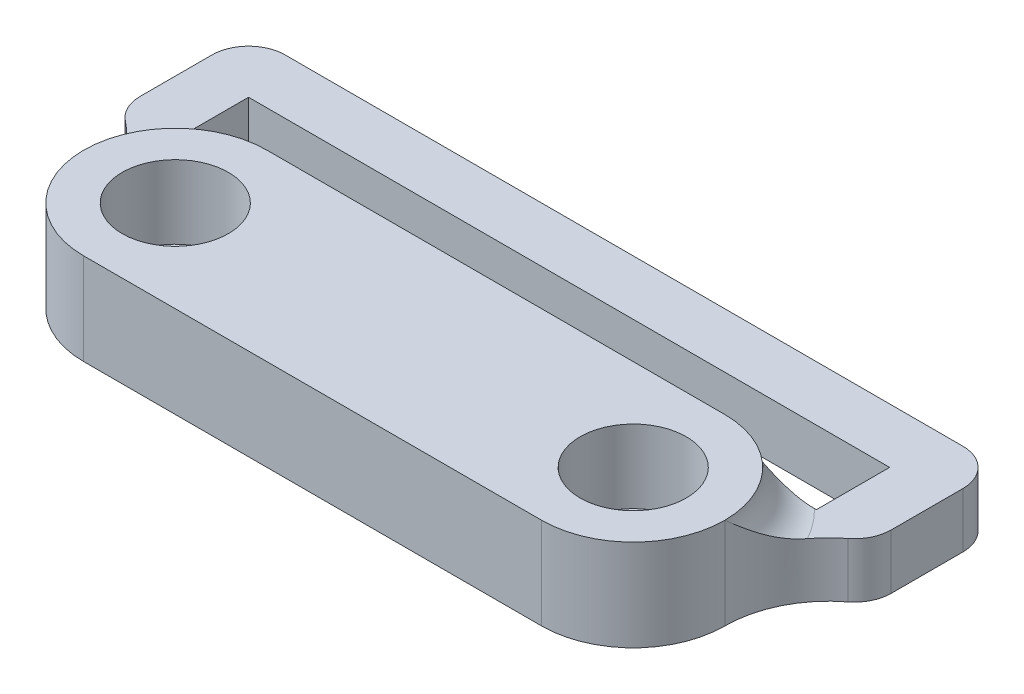
ISO-10303-21;
HEADER;
FILE_DESCRIPTION(('STEP AP214'),'2;1');
FILE_NAME('part.step','',(''),(''),'','','');
FILE_SCHEMA(('AUTOMOTIVE_DESIGN { 1 0 10303 214 1 1 1 1 }'));
ENDSEC;
DATA;
#1=APPLICATION_CONTEXT('core data for automotive mechanical design processes');
#2=APPLICATION_PROTOCOL_DEFINITION('international standard','automotive_design',2000,#1);
#3=PRODUCT_CONTEXT('',#1,'mechanical');
#4=PRODUCT('Part','Part','',(#3));
#5=PRODUCT_RELATED_PRODUCT_CATEGORY('part','',(#4));
#6=PRODUCT_DEFINITION_FORMATION('','',#4);
#7=PRODUCT_DEFINITION_CONTEXT('part definition',#1,'design');
#8=PRODUCT_DEFINITION('design','',#6,#7);
#9=PRODUCT_DEFINITION_SHAPE('','',#8);
#10=(LENGTH_UNIT() NAMED_UNIT(*) SI_UNIT(.MILLI.,.METRE.));
#11=(NAMED_UNIT(*) PLANE_ANGLE_UNIT() SI_UNIT($,.RADIAN.));
#12=(NAMED_UNIT(*) SI_UNIT($,.STERADIAN.) SOLID_ANGLE_UNIT());
#13=UNCERTAINTY_MEASURE_WITH_UNIT(LENGTH_MEASURE(1.E-05),#10,'distance_accuracy_value','');
#14=(GEOMETRIC_REPRESENTATION_CONTEXT(3) GLOBAL_UNCERTAINTY_ASSIGNED_CONTEXT((#13)) GLOBAL_UNIT_ASSIGNED_CONTEXT((#10,
#11,#12)) REPRESENTATION_CONTEXT('',''));
#15=CARTESIAN_POINT('',(0.,0.,0.));
#16=DIRECTION('',(0.,0.,1.));
#17=DIRECTION('',(1.,0.,0.));
#18=AXIS2_PLACEMENT_3D('',#15,#16,#17);
#19=CARTESIAN_POINT('',(12.5,5.,0.));
#20=DIRECTION('',(0.,-1.,0.));
#21=DIRECTION('',(0.,0.,-1.));
#22=AXIS2_PLACEMENT_3D('',#19,#20,#21);
#23=CYLINDRICAL_SURFACE('',#22,5.);
#24=DIRECTION('',(0.,-1.,0.));
#25=VECTOR('',#24,1.);
#26=CARTESIAN_POINT('',(17.5,3.,0.));
#27=LINE('',#26,#25);
#28=CARTESIAN_POINT('',(17.5,5.,0.));
#29=VERTEX_POINT('',#28);
#30=CARTESIAN_POINT('',(17.5,0.,0.));
#31=VERTEX_POINT('',#30);
#32=EDGE_CURVE('E66',#29,#31,#27,.T.);
#33=ORIENTED_EDGE('',*,*,#32,.F.);
#34=CARTESIAN_POINT('',(12.5,5.,0.));
#35=DIRECTION('',(0.,1.,0.));
#36=DIRECTION('',(0.,0.,1.));
#37=AXIS2_PLACEMENT_3D('',#34,#35,#36);
#38=CIRCLE('',#37,5.);
#39=CARTESIAN_POINT('',(12.5,5.,5.));
#40=VERTEX_POINT('',#39);
#41=EDGE_CURVE('E281',#40,#29,#38,.T.);
#42=ORIENTED_EDGE('',*,*,#41,.F.);
#43=DIRECTION('',(0.,-1.,0.));
#44=VECTOR('',#43,1.);
#45=CARTESIAN_POINT('',(12.5,5.,5.));
#46=LINE('',#45,#44);
#47=CARTESIAN_POINT('',(12.5,0.,5.));
#48=VERTEX_POINT('',#47);
#49=EDGE_CURVE('E287',#40,#48,#46,.T.);
#50=ORIENTED_EDGE('',*,*,#49,.T.);
#51=CARTESIAN_POINT('',(12.5,0.,0.));
#52=DIRECTION('',(0.,1.,0.));
#53=DIRECTION('',(0.,0.,1.));
#54=AXIS2_PLACEMENT_3D('',#51,#52,#53);
#55=CIRCLE('',#54,5.);
#56=EDGE_CURVE('E291',#48,#31,#55,.T.);
#57=ORIENTED_EDGE('',*,*,#56,.T.);
#58=EDGE_LOOP('',(#33,#42,#50,#57));
#59=FACE_BOUND('',#58,.T.);
#60=ADVANCED_FACE('F45',(#59),#23,.T.);
#61=CARTESIAN_POINT('',(12.5,5.,0.));
#62=DIRECTION('',(0.,-1.,0.));
#63=DIRECTION('',(0.,0.,-1.));
#64=AXIS2_PLACEMENT_3D('',#61,#62,#63);
#65=CYLINDRICAL_SURFACE('',#64,1.6);
#66=CARTESIAN_POINT('',(12.5,0.,0.));
#67=DIRECTION('',(0.,1.,0.));
#68=DIRECTION('',(0.,0.,1.));
#69=AXIS2_PLACEMENT_3D('',#66,#67,#68);
#70=CIRCLE('',#69,1.6);
#71=CARTESIAN_POINT('',(12.5,0.,1.6));
#72=VERTEX_POINT('',#71);
#73=EDGE_CURVE('E269',#72,#72,#70,.T.);
#74=ORIENTED_EDGE('',*,*,#73,.F.);
#75=EDGE_LOOP('',(#74));
#76=FACE_BOUND('',#75,.T.);
#77=CARTESIAN_POINT('',(12.5,1.,0.));
#78=DIRECTION('',(0.,1.,0.));
#79=DIRECTION('',(0.,0.,1.));
#80=AXIS2_PLACEMENT_3D('',#77,#78,#79);
#81=CIRCLE('',#80,1.6);
#82=CARTESIAN_POINT('',(12.5,1.,1.6));
#83=VERTEX_POINT('',#82);
#84=EDGE_CURVE('E270',#83,#83,#81,.T.);
#85=ORIENTED_EDGE('',*,*,#84,.T.);
#86=EDGE_LOOP('',(#85));
#87=FACE_BOUND('',#86,.T.);
#88=ADVANCED_FACE('F416',(#76,#87),#65,.F.);
#89=CARTESIAN_POINT('',(-12.5,5.,0.));
#90=DIRECTION('',(0.,-1.,0.));
#91=DIRECTION('',(0.,0.,-1.));
#92=AXIS2_PLACEMENT_3D('',#89,#90,#91);
#93=CYLINDRICAL_SURFACE('',#92,1.6);
#94=CARTESIAN_POINT('',(-12.5,0.,0.));
#95=DIRECTION('',(0.,1.,0.));
#96=DIRECTION('',(0.,0.,1.));
#97=AXIS2_PLACEMENT_3D('',#94,#95,#96);
#98=CIRCLE('',#97,1.6);
#99=CARTESIAN_POINT('',(-12.5,0.,1.6));
#100=VERTEX_POINT('',#99);
#101=EDGE_CURVE('E266',#100,#100,#98,.T.);
#102=ORIENTED_EDGE('',*,*,#101,.F.);
#103=EDGE_LOOP('',(#102));
#104=FACE_BOUND('',#103,.T.);
#105=CARTESIAN_POINT('',(-12.5,1.,0.));
#106=DIRECTION('',(0.,1.,0.));
#107=DIRECTION('',(0.,0.,1.));
#108=AXIS2_PLACEMENT_3D('',#105,#106,#107);
#109=CIRCLE('',#108,1.6);
#110=CARTESIAN_POINT('',(-12.5,1.,1.6));
#111=VERTEX_POINT('',#110);
#112=EDGE_CURVE('E257',#111,#111,#109,.T.);
#113=ORIENTED_EDGE('',*,*,#112,.T.);
#114=EDGE_LOOP('',(#113));
#115=FACE_BOUND('',#114,.T.);
#116=ADVANCED_FACE('F412',(#104,#115),#93,.F.);
#117=CARTESIAN_POINT('',(-12.5,5.,0.));
#118=DIRECTION('',(0.,1.,0.));
#119=DIRECTION('',(0.,0.,1.));
#120=AXIS2_PLACEMENT_3D('',#117,#118,#119);
#121=PLANE('',#120);
#122=CARTESIAN_POINT('',(-12.5,5.,0.));
#123=DIRECTION('',(0.,1.,0.));
#124=DIRECTION('',(0.,0.,1.));
#125=AXIS2_PLACEMENT_3D('',#122,#123,#124);
#126=CIRCLE('',#125,2.9);
#127=CARTESIAN_POINT('',(-12.5,5.,2.9));
#128=VERTEX_POINT('',#127);
#129=EDGE_CURVE('E258',#128,#128,#126,.T.);
#130=ORIENTED_EDGE('',*,*,#129,.F.);
#131=EDGE_LOOP('',(#130));
#132=FACE_BOUND('',#131,.T.);
#133=CARTESIAN_POINT('',(12.5,5.,0.));
#134=DIRECTION('',(0.,1.,0.));
#135=DIRECTION('',(0.,0.,1.));
#136=AXIS2_PLACEMENT_3D('',#133,#134,#135);
#137=CIRCLE('',#136,2.9);
#138=CARTESIAN_POINT('',(12.5,5.,2.9));
#139=VERTEX_POINT('',#138);
#140=EDGE_CURVE('E261',#139,#139,#137,.T.);
#141=ORIENTED_EDGE('',*,*,#140,.F.);
#142=EDGE_LOOP('',(#141));
#143=FACE_BOUND('',#142,.T.);
#144=CARTESIAN_POINT('',(-12.5,5.,0.));
#145=DIRECTION('',(0.,1.,0.));
#146=DIRECTION('',(0.,0.,1.));
#147=AXIS2_PLACEMENT_3D('',#144,#145,#146);
#148=CIRCLE('',#147,5.);
#149=CARTESIAN_POINT('',(-12.5,5.,-5.));
#150=VERTEX_POINT('',#149);
#151=CARTESIAN_POINT('',(-17.5,5.,0.));
#152=VERTEX_POINT('',#151);
#153=EDGE_CURVE('E274',#150,#152,#148,.T.);
#154=ORIENTED_EDGE('',*,*,#153,.T.);
#155=CARTESIAN_POINT('',(-12.5,5.,5.));
#156=VERTEX_POINT('',#155);
#157=EDGE_CURVE('E278',#152,#156,#148,.T.);
#158=ORIENTED_EDGE('',*,*,#157,.T.);
#159=DIRECTION('',(1.,0.,0.));
#160=VECTOR('',#159,1.);
#161=CARTESIAN_POINT('',(-12.5,5.,5.));
#162=LINE('',#161,#160);
#163=EDGE_CURVE('E277',#156,#40,#162,.T.);
#164=ORIENTED_EDGE('',*,*,#163,.T.);
#165=ORIENTED_EDGE('',*,*,#41,.T.);
#166=CARTESIAN_POINT('',(12.5,5.,-5.00000000000001));
#167=VERTEX_POINT('',#166);
#168=EDGE_CURVE('E280',#29,#167,#38,.T.);
#169=ORIENTED_EDGE('',*,*,#168,.T.);
#170=DIRECTION('',(-1.,0.,0.));
#171=VECTOR('',#170,1.);
#172=CARTESIAN_POINT('',(-12.5,5.,-5.));
#173=LINE('',#172,#171);
#174=EDGE_CURVE('E284',#167,#150,#173,.T.);
#175=ORIENTED_EDGE('',*,*,#174,.T.);
#176=EDGE_LOOP('',(#154,#158,#164,#165,#169,#175));
#177=FACE_BOUND('',#176,.T.);
#178=ADVANCED_FACE('F415',(#132,#143,#177),#121,.T.);
#179=CARTESIAN_POINT('',(-12.5,0.,0.));
#180=DIRECTION('',(0.,1.,0.));
#181=DIRECTION('',(0.,0.,1.));
#182=AXIS2_PLACEMENT_3D('',#179,#180,#181);
#183=PLANE('',#182);
#184=CARTESIAN_POINT('',(-23.1666666666667,0.,0.));
#185=DIRECTION('',(0.,-1.,0.));
#186=DIRECTION('',(0.,0.,-1.));
#187=AXIS2_PLACEMENT_3D('',#184,#185,#186);
#188=CIRCLE('',#187,5.66666666666669);
#189=CARTESIAN_POINT('',(-19.7173913043478,0.,-4.4959549136987));
#190=VERTEX_POINT('',#189);
#191=CARTESIAN_POINT('',(-17.5,0.,0.));
#192=VERTEX_POINT('',#191);
#193=EDGE_CURVE('E238',#190,#192,#188,.T.);
#194=ORIENTED_EDGE('',*,*,#193,.F.);
#195=CARTESIAN_POINT('',(-18.5,0.,-6.08276253029823));
#196=DIRECTION('',(0.,1.,0.));
#197=DIRECTION('',(0.,0.,1.));
#198=AXIS2_PLACEMENT_3D('',#195,#196,#197);
#199=CIRCLE('',#198,2.);
#200=CARTESIAN_POINT('',(-20.5,0.,-6.08276253029823));
#201=VERTEX_POINT('',#200);
#202=EDGE_CURVE('E313',#190,#201,#199,.F.);
#203=ORIENTED_EDGE('',*,*,#202,.T.);
#204=DIRECTION('',(0.,0.,-1.));
#205=VECTOR('',#204,1.);
#206=CARTESIAN_POINT('',(-20.5,0.,0.));
#207=LINE('',#206,#205);
#208=CARTESIAN_POINT('',(-20.5,0.,-10.));
#209=VERTEX_POINT('',#208);
#210=EDGE_CURVE('E240',#201,#209,#207,.T.);
#211=ORIENTED_EDGE('',*,*,#210,.T.);
#212=CARTESIAN_POINT('',(-18.5,0.,-10.));
#213=DIRECTION('',(0.,1.,0.));
#214=DIRECTION('',(0.,0.,1.));
#215=AXIS2_PLACEMENT_3D('',#212,#213,#214);
#216=CIRCLE('',#215,2.);
#217=CARTESIAN_POINT('',(-18.5,0.,-12.));
#218=VERTEX_POINT('',#217);
#219=EDGE_CURVE('E309',#209,#218,#216,.F.);
#220=ORIENTED_EDGE('',*,*,#219,.T.);
#221=DIRECTION('',(1.,0.,0.));
#222=VECTOR('',#221,1.);
#223=CARTESIAN_POINT('',(0.,0.,-12.));
#224=LINE('',#223,#222);
#225=CARTESIAN_POINT('',(18.5,0.,-12.));
#226=VERTEX_POINT('',#225);
#227=EDGE_CURVE('E224',#218,#226,#224,.T.);
#228=ORIENTED_EDGE('',*,*,#227,.T.);
#229=CARTESIAN_POINT('',(18.5,0.,-10.));
#230=DIRECTION('',(0.,1.,0.));
#231=DIRECTION('',(0.,0.,1.));
#232=AXIS2_PLACEMENT_3D('',#229,#230,#231);
#233=CIRCLE('',#232,2.);
#234=CARTESIAN_POINT('',(20.5,0.,-10.));
#235=VERTEX_POINT('',#234);
#236=EDGE_CURVE('E307',#226,#235,#233,.F.);
#237=ORIENTED_EDGE('',*,*,#236,.T.);
#238=DIRECTION('',(0.,0.,-1.));
#239=VECTOR('',#238,1.);
#240=CARTESIAN_POINT('',(20.5,0.,0.));
#241=LINE('',#240,#239);
#242=CARTESIAN_POINT('',(20.5,0.,-6.08276253029823));
#243=VERTEX_POINT('',#242);
#244=EDGE_CURVE('E227',#243,#235,#241,.T.);
#245=ORIENTED_EDGE('',*,*,#244,.F.);
#246=CARTESIAN_POINT('',(18.5,0.,-6.08276253029823));
#247=DIRECTION('',(0.,1.,0.));
#248=DIRECTION('',(0.,0.,1.));
#249=AXIS2_PLACEMENT_3D('',#246,#247,#248);
#250=CIRCLE('',#249,2.);
#251=CARTESIAN_POINT('',(19.7173913043478,0.,-4.49595491369869));
#252=VERTEX_POINT('',#251);
#253=EDGE_CURVE('E311',#243,#252,#250,.F.);
#254=ORIENTED_EDGE('',*,*,#253,.T.);
#255=CARTESIAN_POINT('',(23.1666666666667,0.,0.));
#256=DIRECTION('',(0.,-1.,0.));
#257=DIRECTION('',(0.,0.,-1.));
#258=AXIS2_PLACEMENT_3D('',#255,#256,#257);
#259=CIRCLE('',#258,5.66666666666669);
#260=EDGE_CURVE('E230',#252,#31,#259,.F.);
#261=ORIENTED_EDGE('',*,*,#260,.T.);
#262=ORIENTED_EDGE('',*,*,#56,.F.);
#263=DIRECTION('',(1.,0.,0.));
#264=VECTOR('',#263,1.);
#265=CARTESIAN_POINT('',(-12.5,0.,5.));
#266=LINE('',#265,#264);
#267=CARTESIAN_POINT('',(-12.5,0.,5.));
#268=VERTEX_POINT('',#267);
#269=EDGE_CURVE('E289',#268,#48,#266,.T.);
#270=ORIENTED_EDGE('',*,*,#269,.F.);
#271=CARTESIAN_POINT('',(-12.5,0.,0.));
#272=DIRECTION('',(0.,1.,0.));
#273=DIRECTION('',(0.,0.,1.));
#274=AXIS2_PLACEMENT_3D('',#271,#272,#273);
#275=CIRCLE('',#274,5.);
#276=EDGE_CURVE('E273',#192,#268,#275,.T.);
#277=ORIENTED_EDGE('',*,*,#276,.F.);
#278=EDGE_LOOP('',(#194,#203,#211,#220,#228,#237,#245,#254,#261,#262,#270,#277));
#279=FACE_BOUND('',#278,.T.);
#280=DIRECTION('',(0.,0.,-1.));
#281=VECTOR('',#280,1.);
#282=CARTESIAN_POINT('',(-17.5,0.,0.));
#283=LINE('',#282,#281);
#284=CARTESIAN_POINT('',(-17.5,0.,-5.00000000000001));
#285=VERTEX_POINT('',#284);
#286=CARTESIAN_POINT('',(-17.5,0.,-9.00000000000001));
#287=VERTEX_POINT('',#286);
#288=EDGE_CURVE('E236',#285,#287,#283,.T.);
#289=ORIENTED_EDGE('',*,*,#288,.F.);
#290=DIRECTION('',(-1.,0.,0.));
#291=VECTOR('',#290,1.);
#292=CARTESIAN_POINT('',(-12.5,0.,-5.));
#293=LINE('',#292,#291);
#294=CARTESIAN_POINT('',(17.5,0.,-5.00000000000001));
#295=VERTEX_POINT('',#294);
#296=EDGE_CURVE('E293',#295,#285,#293,.T.);
#297=ORIENTED_EDGE('',*,*,#296,.F.);
#298=DIRECTION('',(0.,0.,-1.));
#299=VECTOR('',#298,1.);
#300=CARTESIAN_POINT('',(17.5,0.,0.));
#301=LINE('',#300,#299);
#302=CARTESIAN_POINT('',(17.5,0.,-9.00000000000001));
#303=VERTEX_POINT('',#302);
#304=EDGE_CURVE('E201',#295,#303,#301,.T.);
#305=ORIENTED_EDGE('',*,*,#304,.T.);
#306=DIRECTION('',(1.,0.,0.));
#307=VECTOR('',#306,1.);
#308=CARTESIAN_POINT('',(0.,0.,-9.00000000000001));
#309=LINE('',#308,#307);
#310=EDGE_CURVE('E233',#287,#303,#309,.T.);
#311=ORIENTED_EDGE('',*,*,#310,.F.);
#312=EDGE_LOOP('',(#289,#297,#305,#311));
#313=FACE_BOUND('',#312,.T.);
#314=ORIENTED_EDGE('',*,*,#73,.T.);
#315=EDGE_LOOP('',(#314));
#316=FACE_BOUND('',#315,.T.);
#317=ORIENTED_EDGE('',*,*,#101,.T.);
#318=EDGE_LOOP('',(#317));
#319=FACE_BOUND('',#318,.T.);
#320=ADVANCED_FACE('F422',(#279,#313,#316,#319),#183,.F.);
#321=CARTESIAN_POINT('',(-12.5,5.,0.));
#322=DIRECTION('',(0.,-1.,0.));
#323=DIRECTION('',(0.,0.,-1.));
#324=AXIS2_PLACEMENT_3D('',#321,#322,#323);
#325=CYLINDRICAL_SURFACE('',#324,5.);
#326=ORIENTED_EDGE('',*,*,#157,.F.);
#327=DIRECTION('',(0.,-1.,0.));
#328=VECTOR('',#327,1.);
#329=CARTESIAN_POINT('',(-17.5,3.,0.));
#330=LINE('',#329,#328);
#331=EDGE_CURVE('E74',#152,#192,#330,.T.);
#332=ORIENTED_EDGE('',*,*,#331,.T.);
#333=ORIENTED_EDGE('',*,*,#276,.T.);
#334=DIRECTION('',(0.,-1.,0.));
#335=VECTOR('',#334,1.);
#336=CARTESIAN_POINT('',(-12.5,5.,5.));
#337=LINE('',#336,#335);
#338=EDGE_CURVE('E297',#156,#268,#337,.T.);
#339=ORIENTED_EDGE('',*,*,#338,.F.);
#340=EDGE_LOOP('',(#326,#332,#333,#339));
#341=FACE_BOUND('',#340,.T.);
#342=ADVANCED_FACE('F425',(#341),#325,.T.);
#343=CARTESIAN_POINT('',(-12.5,5.,5.));
#344=DIRECTION('',(0.,0.,-1.));
#345=DIRECTION('',(-1.,0.,0.));
#346=AXIS2_PLACEMENT_3D('',#343,#344,#345);
#347=PLANE('',#346);
#348=ORIENTED_EDGE('',*,*,#269,.T.);
#349=ORIENTED_EDGE('',*,*,#49,.F.);
#350=ORIENTED_EDGE('',*,*,#163,.F.);
#351=ORIENTED_EDGE('',*,*,#338,.T.);
#352=EDGE_LOOP('',(#348,#349,#350,#351));
#353=FACE_BOUND('',#352,.T.);
#354=ADVANCED_FACE('F432',(#353),#347,.F.);
#355=CARTESIAN_POINT('',(-12.5,5.,-5.));
#356=DIRECTION('',(0.,0.,1.));
#357=DIRECTION('',(1.,0.,0.));
#358=AXIS2_PLACEMENT_3D('',#355,#356,#357);
#359=PLANE('',#358);
#360=ORIENTED_EDGE('',*,*,#296,.T.);
#361=DIRECTION('',(0.,-1.,0.));
#362=VECTOR('',#361,1.);
#363=CARTESIAN_POINT('',(-17.5,3.,-5.00000000000001));
#364=LINE('',#363,#362);
#365=CARTESIAN_POINT('',(-17.5,3.,-5.00000000000001));
#366=VERTEX_POINT('',#365);
#367=EDGE_CURVE('E246',#366,#285,#364,.T.);
#368=ORIENTED_EDGE('',*,*,#367,.F.);
#369=DIRECTION('',(1.,0.,0.));
#370=VECTOR('',#369,1.);
#371=CARTESIAN_POINT('',(0.,3.,-5.00000000000001));
#372=LINE('',#371,#370);
#373=CARTESIAN_POINT('',(-17.3989794855664,3.,-5.00000000000001));
#374=VERTEX_POINT('',#373);
#375=EDGE_CURVE('E215',#366,#374,#372,.T.);
#376=ORIENTED_EDGE('',*,*,#375,.T.);
#377=CARTESIAN_POINT('',(-17.3989794855664,3.,-5.00000000000001));
#378=CARTESIAN_POINT('',(-17.2638623750682,3.00002316450092,-5.00000000000001));
#379=CARTESIAN_POINT('',(-17.1289185970075,3.00670049991501,-5.));
#380=CARTESIAN_POINT('',(-16.8603844530362,3.03178399805448,-5.));
#381=CARTESIAN_POINT('',(-16.726791871119,3.05016596184593,-5.));
#382=CARTESIAN_POINT('',(-16.3330382569469,3.11978989775551,-5.));
#383=CARTESIAN_POINT('',(-16.0754568289884,3.18561769576501,-5.));
#384=CARTESIAN_POINT('',(-15.5267377159617,3.36015178673736,-5.));
#385=CARTESIAN_POINT('',(-15.2374023383072,3.4742685977324,-5.));
#386=CARTESIAN_POINT('',(-14.6708167532117,3.72964610994945,-5.));
#387=CARTESIAN_POINT('',(-14.3935869754168,3.87095067459572,-5.));
#388=CARTESIAN_POINT('',(-13.8463896428003,4.17142364493052,-5.));
#389=CARTESIAN_POINT('',(-13.5764960235559,4.33072336337446,-5.));
#390=CARTESIAN_POINT('',(-13.0417044781568,4.65747671088043,-5.));
#391=CARTESIAN_POINT('',(-12.7768079043674,4.82493250454181,-5.));
#392=CARTESIAN_POINT('',(-12.5079681899808,4.99496047537353,-5.));
#393=CARTESIAN_POINT('',(-12.5039840946001,4.99748023857129,-5.));
#394=CARTESIAN_POINT('',(-12.5,5.,-5.));
#395=B_SPLINE_CURVE_WITH_KNOTS('',3,(#377,#378,#379,#380,#381,#382,#383,#384,#385,#386,#387,
#388,#389,#390,#391,#392,#393,#394),.UNSPECIFIED.,.F.,.F.,(4,2,2,2,2,2,2,2,4),(0.,
0.404924526419471,0.809014590965268,1.60401403373538,2.53508203530985,3.46766496787549,
4.40755610934854,5.34769806914179,5.3618402047655),.UNSPECIFIED.);
#396=EDGE_CURVE('E345',#374,#150,#395,.T.);
#397=ORIENTED_EDGE('',*,*,#396,.T.);
#398=ORIENTED_EDGE('',*,*,#174,.F.);
#399=CARTESIAN_POINT('',(17.3989794855664,3.,-5.00000000000001));
#400=CARTESIAN_POINT('',(17.2638623750691,3.00002316450091,-5.00000000000001));
#401=CARTESIAN_POINT('',(17.1289185970093,3.00670049991492,-5.00000000000001));
#402=CARTESIAN_POINT('',(16.8603844530395,3.0317839980541,-5.00000000000001));
#403=CARTESIAN_POINT('',(16.7267918711229,3.05016596184536,-5.00000000000001));
#404=CARTESIAN_POINT('',(16.3330382569499,3.11978989775472,-5.00000000000001));
#405=CARTESIAN_POINT('',(16.0754568289898,3.18561769576445,-5.00000000000001));
#406=CARTESIAN_POINT('',(15.5267377159615,3.36015178673755,-5.00000000000001));
#407=CARTESIAN_POINT('',(15.237402338307,3.47426859773303,-5.00000000000001));
#408=CARTESIAN_POINT('',(14.6708167532099,3.72964610994972,-5.00000000000001));
#409=CARTESIAN_POINT('',(14.3935869754136,3.87095067459523,-5.00000000000001));
#410=CARTESIAN_POINT('',(13.8463896427989,4.17142364493359,-5.));
#411=CARTESIAN_POINT('',(13.5764960235577,4.33072336338182,-4.99999999999999));
#412=CARTESIAN_POINT('',(13.0417044781518,4.657476710875,-5.00000000000002));
#413=CARTESIAN_POINT('',(12.7768079043524,4.82493250451928,-5.00000000000006));
#414=CARTESIAN_POINT('',(12.5079681899804,4.99496047537283,-5.00000000000001));
#415=CARTESIAN_POINT('',(12.5039840945999,4.99748023857094,-5.00000000000001));
#416=CARTESIAN_POINT('',(12.5,5.,-5.00000000000001));
#417=B_SPLINE_CURVE_WITH_KNOTS('',3,(#399,#400,#401,#402,#403,#404,#405,#406,#407,#408,#409,
#410,#411,#412,#413,#414,#415,#416),.UNSPECIFIED.,.F.,.F.,(4,2,2,2,2,2,2,2,4),(0.,
0.404924526416853,0.809014590960607,1.60401403373539,2.53508203531066,3.4676649678788,
4.40755610935054,5.34769806914173,5.3618402047655),.UNSPECIFIED.);
#418=CARTESIAN_POINT('',(17.3989794855664,3.,-5.00000000000001));
#419=VERTEX_POINT('',#418);
#420=EDGE_CURVE('E11',#167,#419,#417,.F.);
#421=ORIENTED_EDGE('',*,*,#420,.T.);
#422=DIRECTION('',(1.,0.,0.));
#423=VECTOR('',#422,1.);
#424=CARTESIAN_POINT('',(0.,3.,-5.00000000000001));
#425=LINE('',#424,#423);
#426=CARTESIAN_POINT('',(17.5,3.,-5.00000000000001));
#427=VERTEX_POINT('',#426);
#428=EDGE_CURVE('E183',#419,#427,#425,.T.);
#429=ORIENTED_EDGE('',*,*,#428,.T.);
#430=DIRECTION('',(0.,-1.,0.));
#431=VECTOR('',#430,1.);
#432=CARTESIAN_POINT('',(17.5,3.,-5.00000000000001));
#433=LINE('',#432,#431);
#434=EDGE_CURVE('E186',#427,#295,#433,.T.);
#435=ORIENTED_EDGE('',*,*,#434,.T.);
#436=EDGE_LOOP('',(#360,#368,#376,#397,#398,#421,#429,#435));
#437=FACE_BOUND('',#436,.T.);
#438=ADVANCED_FACE('F185',(#437),#359,.F.);
#439=CARTESIAN_POINT('',(-12.5,1.,0.));
#440=DIRECTION('',(0.,1.,0.));
#441=DIRECTION('',(0.,0.,1.));
#442=AXIS2_PLACEMENT_3D('',#439,#440,#441);
#443=CYLINDRICAL_SURFACE('',#442,2.9);
#444=CARTESIAN_POINT('',(-12.5,1.,0.));
#445=DIRECTION('',(0.,1.,0.));
#446=DIRECTION('',(0.,0.,1.));
#447=AXIS2_PLACEMENT_3D('',#444,#445,#446);
#448=CIRCLE('',#447,2.9);
#449=CARTESIAN_POINT('',(-12.5,1.,2.9));
#450=VERTEX_POINT('',#449);
#451=EDGE_CURVE('E254',#450,#450,#448,.T.);
#452=ORIENTED_EDGE('',*,*,#451,.F.);
#453=EDGE_LOOP('',(#452));
#454=FACE_BOUND('',#453,.T.);
#455=ORIENTED_EDGE('',*,*,#129,.T.);
#456=EDGE_LOOP('',(#455));
#457=FACE_BOUND('',#456,.T.);
#458=ADVANCED_FACE('F401',(#454,#457),#443,.F.);
#459=CARTESIAN_POINT('',(-12.5,1.,0.));
#460=DIRECTION('',(0.,1.,0.));
#461=DIRECTION('',(0.,0.,1.));
#462=AXIS2_PLACEMENT_3D('',#459,#460,#461);
#463=PLANE('',#462);
#464=ORIENTED_EDGE('',*,*,#112,.F.);
#465=EDGE_LOOP('',(#464));
#466=FACE_BOUND('',#465,.T.);
#467=ORIENTED_EDGE('',*,*,#451,.T.);
#468=EDGE_LOOP('',(#467));
#469=FACE_BOUND('',#468,.T.);
#470=ADVANCED_FACE('F397',(#466,#469),#463,.T.);
#471=CARTESIAN_POINT('',(12.5,1.,0.));
#472=DIRECTION('',(0.,1.,0.));
#473=DIRECTION('',(0.,0.,1.));
#474=AXIS2_PLACEMENT_3D('',#471,#472,#473);
#475=CYLINDRICAL_SURFACE('',#474,2.9);
#476=CARTESIAN_POINT('',(12.5,1.,0.));
#477=DIRECTION('',(0.,1.,0.));
#478=DIRECTION('',(0.,0.,1.));
#479=AXIS2_PLACEMENT_3D('',#476,#477,#478);
#480=CIRCLE('',#479,2.9);
#481=CARTESIAN_POINT('',(12.5,1.,2.9));
#482=VERTEX_POINT('',#481);
#483=EDGE_CURVE('E245',#482,#482,#480,.T.);
#484=ORIENTED_EDGE('',*,*,#483,.F.);
#485=EDGE_LOOP('',(#484));
#486=FACE_BOUND('',#485,.T.);
#487=ORIENTED_EDGE('',*,*,#140,.T.);
#488=EDGE_LOOP('',(#487));
#489=FACE_BOUND('',#488,.T.);
#490=ADVANCED_FACE('F400',(#486,#489),#475,.F.);
#491=CARTESIAN_POINT('',(12.5,1.,0.));
#492=DIRECTION('',(0.,1.,0.));
#493=DIRECTION('',(0.,0.,1.));
#494=AXIS2_PLACEMENT_3D('',#491,#492,#493);
#495=PLANE('',#494);
#496=ORIENTED_EDGE('',*,*,#84,.F.);
#497=EDGE_LOOP('',(#496));
#498=FACE_BOUND('',#497,.T.);
#499=ORIENTED_EDGE('',*,*,#483,.T.);
#500=EDGE_LOOP('',(#499));
#501=FACE_BOUND('',#500,.T.);
#502=ADVANCED_FACE('F395',(#498,#501),#495,.T.);
#503=CARTESIAN_POINT('',(0.,3.,-12.));
#504=DIRECTION('',(0.,0.,-1.));
#505=DIRECTION('',(-1.,0.,0.));
#506=AXIS2_PLACEMENT_3D('',#503,#504,#505);
#507=PLANE('',#506);
#508=ORIENTED_EDGE('',*,*,#227,.F.);
#509=DIRECTION('',(0.,-1.,0.));
#510=VECTOR('',#509,1.);
#511=CARTESIAN_POINT('',(-18.5,3.,-12.));
#512=LINE('',#511,#510);
#513=CARTESIAN_POINT('',(-18.5,3.,-12.));
#514=VERTEX_POINT('',#513);
#515=EDGE_CURVE('E343',#218,#514,#512,.F.);
#516=ORIENTED_EDGE('',*,*,#515,.T.);
#517=DIRECTION('',(1.,0.,0.));
#518=VECTOR('',#517,1.);
#519=CARTESIAN_POINT('',(0.,3.,-12.));
#520=LINE('',#519,#518);
#521=CARTESIAN_POINT('',(18.5,3.,-12.));
#522=VERTEX_POINT('',#521);
#523=EDGE_CURVE('E243',#514,#522,#520,.T.);
#524=ORIENTED_EDGE('',*,*,#523,.T.);
#525=DIRECTION('',(0.,-1.,0.));
#526=VECTOR('',#525,1.);
#527=CARTESIAN_POINT('',(18.5,0.,-12.));
#528=LINE('',#527,#526);
#529=EDGE_CURVE('E340',#522,#226,#528,.T.);
#530=ORIENTED_EDGE('',*,*,#529,.T.);
#531=EDGE_LOOP('',(#508,#516,#524,#530));
#532=FACE_BOUND('',#531,.T.);
#533=ADVANCED_FACE('F391',(#532),#507,.T.);
#534=CARTESIAN_POINT('',(-20.5,3.,0.));
#535=DIRECTION('',(-1.,0.,0.));
#536=DIRECTION('',(0.,0.,1.));
#537=AXIS2_PLACEMENT_3D('',#534,#535,#536);
#538=PLANE('',#537);
#539=ORIENTED_EDGE('',*,*,#210,.F.);
#540=DIRECTION('',(0.,1.,0.));
#541=VECTOR('',#540,1.);
#542=CARTESIAN_POINT('',(-20.5,3.,-6.08276253029823));
#543=LINE('',#542,#541);
#544=CARTESIAN_POINT('',(-20.5,3.,-6.08276253029823));
#545=VERTEX_POINT('',#544);
#546=EDGE_CURVE('E318',#201,#545,#543,.T.);
#547=ORIENTED_EDGE('',*,*,#546,.T.);
#548=DIRECTION('',(0.,0.,-1.));
#549=VECTOR('',#548,1.);
#550=CARTESIAN_POINT('',(-20.5,3.,0.));
#551=LINE('',#550,#549);
#552=CARTESIAN_POINT('',(-20.5,3.,-10.));
#553=VERTEX_POINT('',#552);
#554=EDGE_CURVE('E221',#545,#553,#551,.T.);
#555=ORIENTED_EDGE('',*,*,#554,.T.);
#556=DIRECTION('',(0.,-1.,0.));
#557=VECTOR('',#556,1.);
#558=CARTESIAN_POINT('',(-20.5,3.,-10.));
#559=LINE('',#558,#557);
#560=EDGE_CURVE('E315',#553,#209,#559,.T.);
#561=ORIENTED_EDGE('',*,*,#560,.T.);
#562=EDGE_LOOP('',(#539,#547,#555,#561));
#563=FACE_BOUND('',#562,.T.);
#564=ADVANCED_FACE('F394',(#563),#538,.T.);
#565=CARTESIAN_POINT('',(-23.1666666666667,3.,0.));
#566=DIRECTION('',(0.,-1.,0.));
#567=DIRECTION('',(0.,0.,-1.));
#568=AXIS2_PLACEMENT_3D('',#565,#566,#567);
#569=CYLINDRICAL_SURFACE('',#568,5.66666666666669);
#570=CARTESIAN_POINT('',(-23.1666666666667,3.,0.));
#571=DIRECTION('',(0.,-1.,0.));
#572=DIRECTION('',(0.,0.,-1.));
#573=AXIS2_PLACEMENT_3D('',#570,#571,#572);
#574=CIRCLE('',#573,5.66666666666669);
#575=CARTESIAN_POINT('',(-19.7173913043478,3.,-4.4959549136987));
#576=VERTEX_POINT('',#575);
#577=CARTESIAN_POINT('',(-18.625,3.,-3.38886042793149));
#578=VERTEX_POINT('',#577);
#579=EDGE_CURVE('E218',#576,#578,#574,.T.);
#580=ORIENTED_EDGE('',*,*,#579,.F.);
#581=DIRECTION('',(0.,-1.,0.));
#582=VECTOR('',#581,1.);
#583=CARTESIAN_POINT('',(-19.7173913043478,3.,-4.4959549136987));
#584=LINE('',#583,#582);
#585=EDGE_CURVE('E300',#576,#190,#584,.T.);
#586=ORIENTED_EDGE('',*,*,#585,.T.);
#587=ORIENTED_EDGE('',*,*,#193,.T.);
#588=ORIENTED_EDGE('',*,*,#331,.F.);
#589=CARTESIAN_POINT('',(-18.625,3.,-3.38886042793149));
#590=CARTESIAN_POINT('',(-18.5731473672124,2.99998198063057,-3.31940857175419));
#591=CARTESIAN_POINT('',(-18.5229858955266,3.00467617585675,-3.24882041275677));
#592=CARTESIAN_POINT('',(-18.4265251879861,3.02251778744796,-3.10636053612797));
#593=CARTESIAN_POINT('',(-18.380215643008,3.03564176274744,-3.03449291352096));
#594=CARTESIAN_POINT('',(-18.2923845254375,3.06910148074707,-2.89127119593199));
#595=CARTESIAN_POINT('',(-18.2507961129682,3.08931360777535,-2.81992844983837));
#596=CARTESIAN_POINT('',(-18.1715650773504,3.13607435381631,-2.67707761024231));
#597=CARTESIAN_POINT('',(-18.1339255886135,3.16262795234256,-2.60556943075513));
#598=CARTESIAN_POINT('',(-18.0526865742704,3.2292990688838,-2.44309205236784));
#599=CARTESIAN_POINT('',(-18.0103199983194,3.27113668006266,-2.35221327321106));
#600=CARTESIAN_POINT('',(-17.931655087831,3.36205866514077,-2.17151508118329));
#601=CARTESIAN_POINT('',(-17.8953577953041,3.41114428070175,-2.0816958526775));
#602=CARTESIAN_POINT('',(-17.7944171204929,3.567876941806,-1.81297859974458));
#603=CARTESIAN_POINT('',(-17.7383229812256,3.68446149006187,-1.63604774250619));
#604=CARTESIAN_POINT('',(-17.6583325119402,3.8976950828999,-1.33650155362046));
#605=CARTESIAN_POINT('',(-17.6298198965822,3.99085440142074,-1.21248172102361));
#606=CARTESIAN_POINT('',(-17.5816719077886,4.1824972287334,-0.966757928818522));
#607=CARTESIAN_POINT('',(-17.5620403682709,4.28098301643617,-0.845054991078161));
#608=CARTESIAN_POINT('',(-17.5309307495331,4.48099447528274,-0.603634681556028));
#609=CARTESIAN_POINT('',(-17.5194345155064,4.5825128474316,-0.483913474627943));
#610=CARTESIAN_POINT('',(-17.5040546647014,4.78710308969267,-0.245380485819182));
#611=CARTESIAN_POINT('',(-17.5001682821126,4.89017438166387,-0.126568389166045));
#612=CARTESIAN_POINT('',(-17.5000017884166,4.99549630155592,-0.00519025651321143));
#613=CARTESIAN_POINT('',(-17.5000000059685,4.99774815522116,-0.00259512341338597));
#614=CARTESIAN_POINT('',(-17.5,5.,0.));
#615=B_SPLINE_CURVE_WITH_KNOTS('',3,(#589,#590,#591,#592,#593,#594,#595,#596,#597,#598,#599,
#600,#601,#602,#603,#604,#605,#606,#607,#608,#609,#610,#611,#612,#613,#614),.UNSPECIFIED.,.F.,
.F.,(4,2,2,2,2,2,2,2,2,2,2,2,4),(0.,0.259721841140786,0.518724570574844,0.773418240596786,
1.02831256513664,1.353741357081,1.67922596332379,2.33454654131106,2.80737193084823,
3.28040124250494,3.75237158085792,4.22417034910447,4.23447811455598),.UNSPECIFIED.);
#616=EDGE_CURVE('E352',#152,#578,#615,.F.);
#617=ORIENTED_EDGE('',*,*,#616,.T.);
#618=EDGE_LOOP('',(#580,#586,#587,#588,#617));
#619=FACE_BOUND('',#618,.T.);
#620=ADVANCED_FACE('F458',(#619),#569,.F.);
#621=CARTESIAN_POINT('',(-17.5,3.,0.));
#622=DIRECTION('',(-1.,0.,0.));
#623=DIRECTION('',(0.,0.,1.));
#624=AXIS2_PLACEMENT_3D('',#621,#622,#623);
#625=PLANE('',#624);
#626=ORIENTED_EDGE('',*,*,#288,.T.);
#627=DIRECTION('',(0.,-1.,0.));
#628=VECTOR('',#627,1.);
#629=CARTESIAN_POINT('',(-17.5,3.,-9.00000000000001));
#630=LINE('',#629,#628);
#631=CARTESIAN_POINT('',(-17.5,3.,-9.00000000000001));
#632=VERTEX_POINT('',#631);
#633=EDGE_CURVE('E249',#632,#287,#630,.T.);
#634=ORIENTED_EDGE('',*,*,#633,.F.);
#635=DIRECTION('',(0.,0.,-1.));
#636=VECTOR('',#635,1.);
#637=CARTESIAN_POINT('',(-17.5,3.,0.));
#638=LINE('',#637,#636);
#639=EDGE_CURVE('E210',#366,#632,#638,.T.);
#640=ORIENTED_EDGE('',*,*,#639,.F.);
#641=ORIENTED_EDGE('',*,*,#367,.T.);
#642=EDGE_LOOP('',(#626,#634,#640,#641));
#643=FACE_BOUND('',#642,.T.);
#644=ADVANCED_FACE('F466',(#643),#625,.F.);
#645=CARTESIAN_POINT('',(0.,3.,-9.00000000000001));
#646=DIRECTION('',(0.,0.,-1.));
#647=DIRECTION('',(-1.,0.,0.));
#648=AXIS2_PLACEMENT_3D('',#645,#646,#647);
#649=PLANE('',#648);
#650=ORIENTED_EDGE('',*,*,#310,.T.);
#651=DIRECTION('',(0.,-1.,0.));
#652=VECTOR('',#651,1.);
#653=CARTESIAN_POINT('',(17.5,3.,-9.00000000000001));
#654=LINE('',#653,#652);
#655=CARTESIAN_POINT('',(17.5,3.,-9.00000000000001));
#656=VERTEX_POINT('',#655);
#657=EDGE_CURVE('E202',#656,#303,#654,.T.);
#658=ORIENTED_EDGE('',*,*,#657,.F.);
#659=DIRECTION('',(1.,0.,0.));
#660=VECTOR('',#659,1.);
#661=CARTESIAN_POINT('',(0.,3.,-9.00000000000001));
#662=LINE('',#661,#660);
#663=EDGE_CURVE('E207',#632,#656,#662,.T.);
#664=ORIENTED_EDGE('',*,*,#663,.F.);
#665=ORIENTED_EDGE('',*,*,#633,.T.);
#666=EDGE_LOOP('',(#650,#658,#664,#665));
#667=FACE_BOUND('',#666,.T.);
#668=ADVANCED_FACE('F469',(#667),#649,.F.);
#669=CARTESIAN_POINT('',(17.5,3.,0.));
#670=DIRECTION('',(-1.,0.,0.));
#671=DIRECTION('',(0.,0.,1.));
#672=AXIS2_PLACEMENT_3D('',#669,#670,#671);
#673=PLANE('',#672);
#674=ORIENTED_EDGE('',*,*,#304,.F.);
#675=ORIENTED_EDGE('',*,*,#434,.F.);
#676=DIRECTION('',(0.,0.,-1.));
#677=VECTOR('',#676,1.);
#678=CARTESIAN_POINT('',(17.5,3.,0.));
#679=LINE('',#678,#677);
#680=EDGE_CURVE('E194',#427,#656,#679,.T.);
#681=ORIENTED_EDGE('',*,*,#680,.T.);
#682=ORIENTED_EDGE('',*,*,#657,.T.);
#683=EDGE_LOOP('',(#674,#675,#681,#682));
#684=FACE_BOUND('',#683,.T.);
#685=ADVANCED_FACE('F199',(#684),#673,.T.);
#686=CARTESIAN_POINT('',(23.1666666666667,3.,0.));
#687=DIRECTION('',(0.,-1.,0.));
#688=DIRECTION('',(0.,0.,-1.));
#689=AXIS2_PLACEMENT_3D('',#686,#687,#688);
#690=CYLINDRICAL_SURFACE('',#689,5.66666666666669);
#691=ORIENTED_EDGE('',*,*,#260,.F.);
#692=DIRECTION('',(0.,-1.,0.));
#693=VECTOR('',#692,1.);
#694=CARTESIAN_POINT('',(19.7173913043478,3.,-4.49595491369869));
#695=LINE('',#694,#693);
#696=CARTESIAN_POINT('',(19.7173913043478,3.,-4.49595491369869));
#697=VERTEX_POINT('',#696);
#698=EDGE_CURVE('E338',#252,#697,#695,.F.);
#699=ORIENTED_EDGE('',*,*,#698,.T.);
#700=CARTESIAN_POINT('',(23.1666666666667,3.,0.));
#701=DIRECTION('',(0.,-1.,0.));
#702=DIRECTION('',(0.,0.,-1.));
#703=AXIS2_PLACEMENT_3D('',#700,#701,#702);
#704=CIRCLE('',#703,5.66666666666669);
#705=CARTESIAN_POINT('',(18.625,3.,-3.38886042793149));
#706=VERTEX_POINT('',#705);
#707=EDGE_CURVE('E195',#697,#706,#704,.F.);
#708=ORIENTED_EDGE('',*,*,#707,.T.);
#709=CARTESIAN_POINT('',(18.625,3.,-3.38886042793149));
#710=CARTESIAN_POINT('',(18.5731473672124,2.99998198063057,-3.31940857175412));
#711=CARTESIAN_POINT('',(18.5229858955265,3.00467617585676,-3.24882041275662));
#712=CARTESIAN_POINT('',(18.4265251879859,3.022517787448,-3.10636053612768));
#713=CARTESIAN_POINT('',(18.3802156430077,3.03564176274751,-3.03449291352059));
#714=CARTESIAN_POINT('',(18.2923845254373,3.06910148074717,-2.89127119593161));
#715=CARTESIAN_POINT('',(18.250796112968,3.08931360777545,-2.81992844983806));
#716=CARTESIAN_POINT('',(18.1715650773503,3.13607435381636,-2.67707761024215));
#717=CARTESIAN_POINT('',(18.1339255886135,3.16262795234259,-2.60556943075505));
#718=CARTESIAN_POINT('',(18.0526865742705,3.22929906888377,-2.44309205236789));
#719=CARTESIAN_POINT('',(18.0103199983194,3.27113668006261,-2.35221327321116));
#720=CARTESIAN_POINT('',(17.9316550878311,3.36205866514067,-2.17151508118349));
#721=CARTESIAN_POINT('',(17.8953577953042,3.41114428070161,-2.08169585267774));
#722=CARTESIAN_POINT('',(17.794417120493,3.56787694180587,-1.81297859974476));
#723=CARTESIAN_POINT('',(17.7383229812257,3.68446149006177,-1.63604774250625));
#724=CARTESIAN_POINT('',(17.6583325119402,3.89769508289994,-1.33650155362047));
#725=CARTESIAN_POINT('',(17.6298198965822,3.99085440142084,-1.21248172102365));
#726=CARTESIAN_POINT('',(17.5816719077886,4.18249722873338,-0.966757928818354));
#727=CARTESIAN_POINT('',(17.5620403682709,4.28098301643595,-0.845054991077741));
#728=CARTESIAN_POINT('',(17.5309307495331,4.48099447528319,-0.603634681556143));
#729=CARTESIAN_POINT('',(17.5194345155063,4.58251284743291,-0.483913474628843));
#730=CARTESIAN_POINT('',(17.5040546647014,4.78710308969153,-0.245380485818067));
#731=CARTESIAN_POINT('',(17.5001682821126,4.89017438165944,-0.126568389162132));
#732=CARTESIAN_POINT('',(17.5000017884166,4.99549630155573,-0.00519025651304393));
#733=CARTESIAN_POINT('',(17.5000000059685,4.99774815522107,-0.00259512341330064));
#734=CARTESIAN_POINT('',(17.5,5.,0.));
#735=B_SPLINE_CURVE_WITH_KNOTS('',3,(#709,#710,#711,#712,#713,#714,#715,#716,#717,#718,#719,
#720,#721,#722,#723,#724,#725,#726,#727,#728,#729,#730,#731,#732,#733,#734),.UNSPECIFIED.,.F.,
.F.,(4,2,2,2,2,2,2,2,2,2,2,2,4),(0.,0.259721841141049,0.518724570575377,0.773418240597057,
1.02831256513664,1.35374135708081,1.67922596332344,2.33454654131106,2.80737193084828,
3.28040124250518,3.75237158085806,4.22417034910447,4.23447811455598),.UNSPECIFIED.);
#736=EDGE_CURVE('E59',#706,#29,#735,.T.);
#737=ORIENTED_EDGE('',*,*,#736,.T.);
#738=ORIENTED_EDGE('',*,*,#32,.T.);
#739=EDGE_LOOP('',(#691,#699,#708,#737,#738));
#740=FACE_BOUND('',#739,.T.);
#741=ADVANCED_FACE('F380',(#740),#690,.F.);
#742=CARTESIAN_POINT('',(20.5,3.,0.));
#743=DIRECTION('',(-1.,0.,0.));
#744=DIRECTION('',(0.,0.,1.));
#745=AXIS2_PLACEMENT_3D('',#742,#743,#744);
#746=PLANE('',#745);
#747=DIRECTION('',(0.,0.,-1.));
#748=VECTOR('',#747,1.);
#749=CARTESIAN_POINT('',(20.5,3.,0.));
#750=LINE('',#749,#748);
#751=CARTESIAN_POINT('',(20.5,3.,-6.08276253029823));
#752=VERTEX_POINT('',#751);
#753=CARTESIAN_POINT('',(20.5,3.,-10.));
#754=VERTEX_POINT('',#753);
#755=EDGE_CURVE('E490',#752,#754,#750,.T.);
#756=ORIENTED_EDGE('',*,*,#755,.F.);
#757=DIRECTION('',(0.,1.,0.));
#758=VECTOR('',#757,1.);
#759=CARTESIAN_POINT('',(20.5,0.,-6.08276253029823));
#760=LINE('',#759,#758);
#761=EDGE_CURVE('E335',#752,#243,#760,.F.);
#762=ORIENTED_EDGE('',*,*,#761,.T.);
#763=ORIENTED_EDGE('',*,*,#244,.T.);
#764=DIRECTION('',(0.,-1.,0.));
#765=VECTOR('',#764,1.);
#766=CARTESIAN_POINT('',(20.5,3.,-10.));
#767=LINE('',#766,#765);
#768=EDGE_CURVE('E333',#235,#754,#767,.F.);
#769=ORIENTED_EDGE('',*,*,#768,.T.);
#770=EDGE_LOOP('',(#756,#762,#763,#769));
#771=FACE_BOUND('',#770,.T.);
#772=ADVANCED_FACE('F385',(#771),#746,.F.);
#773=CARTESIAN_POINT('',(0.,3.,0.));
#774=DIRECTION('',(0.,-1.,0.));
#775=DIRECTION('',(0.,0.,-1.));
#776=AXIS2_PLACEMENT_3D('',#773,#774,#775);
#777=PLANE('',#776);
#778=ORIENTED_EDGE('',*,*,#554,.F.);
#779=CARTESIAN_POINT('',(-18.5,3.,-6.08276253029823));
#780=DIRECTION('',(0.,-1.,0.));
#781=DIRECTION('',(0.,0.,-1.));
#782=AXIS2_PLACEMENT_3D('',#779,#780,#781);
#783=CIRCLE('',#782,2.);
#784=EDGE_CURVE('E331',#545,#576,#783,.F.);
#785=ORIENTED_EDGE('',*,*,#784,.T.);
#786=ORIENTED_EDGE('',*,*,#579,.T.);
#787=CARTESIAN_POINT('',(-12.5,3.,0.));
#788=DIRECTION('',(0.,-1.,0.));
#789=DIRECTION('',(0.,0.,-1.));
#790=AXIS2_PLACEMENT_3D('',#787,#788,#789);
#791=CIRCLE('',#790,7.);
#792=EDGE_CURVE('E326',#578,#374,#791,.T.);
#793=ORIENTED_EDGE('',*,*,#792,.T.);
#794=ORIENTED_EDGE('',*,*,#375,.F.);
#795=ORIENTED_EDGE('',*,*,#639,.T.);
#796=ORIENTED_EDGE('',*,*,#663,.T.);
#797=ORIENTED_EDGE('',*,*,#680,.F.);
#798=ORIENTED_EDGE('',*,*,#428,.F.);
#799=CARTESIAN_POINT('',(12.5,3.,0.));
#800=DIRECTION('',(0.,-1.,0.));
#801=DIRECTION('',(0.,0.,-1.));
#802=AXIS2_PLACEMENT_3D('',#799,#800,#801);
#803=CIRCLE('',#802,7.);
#804=EDGE_CURVE('E324',#419,#706,#803,.T.);
#805=ORIENTED_EDGE('',*,*,#804,.T.);
#806=ORIENTED_EDGE('',*,*,#707,.F.);
#807=CARTESIAN_POINT('',(18.5,3.,-6.08276253029823));
#808=DIRECTION('',(0.,-1.,0.));
#809=DIRECTION('',(0.,0.,-1.));
#810=AXIS2_PLACEMENT_3D('',#807,#808,#809);
#811=CIRCLE('',#810,2.);
#812=EDGE_CURVE('E329',#697,#752,#811,.F.);
#813=ORIENTED_EDGE('',*,*,#812,.T.);
#814=ORIENTED_EDGE('',*,*,#755,.T.);
#815=CARTESIAN_POINT('',(18.5,3.,-10.));
#816=DIRECTION('',(0.,-1.,0.));
#817=DIRECTION('',(0.,0.,-1.));
#818=AXIS2_PLACEMENT_3D('',#815,#816,#817);
#819=CIRCLE('',#818,2.);
#820=EDGE_CURVE('E320',#754,#522,#819,.F.);
#821=ORIENTED_EDGE('',*,*,#820,.T.);
#822=ORIENTED_EDGE('',*,*,#523,.F.);
#823=CARTESIAN_POINT('',(-18.5,3.,-10.));
#824=DIRECTION('',(0.,-1.,0.));
#825=DIRECTION('',(0.,0.,-1.));
#826=AXIS2_PLACEMENT_3D('',#823,#824,#825);
#827=CIRCLE('',#826,2.);
#828=EDGE_CURVE('E322',#514,#553,#827,.F.);
#829=ORIENTED_EDGE('',*,*,#828,.T.);
#830=EDGE_LOOP('',(#778,#785,#786,#793,#794,#795,#796,#797,#798,#805,#806,#813,#814,#821,#822,#829));
#831=FACE_BOUND('',#830,.T.);
#832=ADVANCED_FACE('F205',(#831),#777,.F.);
#833=CARTESIAN_POINT('',(-18.5,3.,-6.08276253029823));
#834=DIRECTION('',(0.,-1.,0.));
#835=DIRECTION('',(0.,0.,-1.));
#836=AXIS2_PLACEMENT_3D('',#833,#834,#835);
#837=CYLINDRICAL_SURFACE('',#836,2.);
#838=ORIENTED_EDGE('',*,*,#784,.F.);
#839=ORIENTED_EDGE('',*,*,#546,.F.);
#840=ORIENTED_EDGE('',*,*,#202,.F.);
#841=ORIENTED_EDGE('',*,*,#585,.F.);
#842=EDGE_LOOP('',(#838,#839,#840,#841));
#843=FACE_BOUND('',#842,.T.);
#844=ADVANCED_FACE('F444',(#843),#837,.T.);
#845=CARTESIAN_POINT('',(18.5,3.,-6.08276253029823));
#846=DIRECTION('',(0.,-1.,0.));
#847=DIRECTION('',(0.,0.,-1.));
#848=AXIS2_PLACEMENT_3D('',#845,#846,#847);
#849=CYLINDRICAL_SURFACE('',#848,2.);
#850=ORIENTED_EDGE('',*,*,#812,.F.);
#851=ORIENTED_EDGE('',*,*,#698,.F.);
#852=ORIENTED_EDGE('',*,*,#253,.F.);
#853=ORIENTED_EDGE('',*,*,#761,.F.);
#854=EDGE_LOOP('',(#850,#851,#852,#853));
#855=FACE_BOUND('',#854,.T.);
#856=ADVANCED_FACE('F366',(#855),#849,.T.);
#857=CARTESIAN_POINT('',(-12.5,5.,0.));
#858=DIRECTION('',(0.,-1.,0.));
#859=DIRECTION('',(0.,0.,-1.));
#860=AXIS2_PLACEMENT_3D('',#857,#858,#859);
#861=TOROIDAL_SURFACE('',#860,7.,2.);
#862=ORIENTED_EDGE('',*,*,#616,.F.);
#863=ORIENTED_EDGE('',*,*,#153,.F.);
#864=ORIENTED_EDGE('',*,*,#396,.F.);
#865=ORIENTED_EDGE('',*,*,#792,.F.);
#866=EDGE_LOOP('',(#862,#863,#864,#865));
#867=FACE_BOUND('',#866,.T.);
#868=ADVANCED_FACE('F361',(#867),#861,.F.);
#869=CARTESIAN_POINT('',(12.5,5.,0.));
#870=DIRECTION('',(0.,-1.,0.));
#871=DIRECTION('',(0.,0.,-1.));
#872=AXIS2_PLACEMENT_3D('',#869,#870,#871);
#873=TOROIDAL_SURFACE('',#872,7.,2.);
#874=ORIENTED_EDGE('',*,*,#420,.F.);
#875=ORIENTED_EDGE('',*,*,#168,.F.);
#876=ORIENTED_EDGE('',*,*,#736,.F.);
#877=ORIENTED_EDGE('',*,*,#804,.F.);
#878=EDGE_LOOP('',(#874,#875,#876,#877));
#879=FACE_BOUND('',#878,.T.);
#880=ADVANCED_FACE('F365',(#879),#873,.F.);
#881=CARTESIAN_POINT('',(-18.5,3.,-10.));
#882=DIRECTION('',(0.,-1.,0.));
#883=DIRECTION('',(0.,0.,-1.));
#884=AXIS2_PLACEMENT_3D('',#881,#882,#883);
#885=CYLINDRICAL_SURFACE('',#884,2.);
#886=ORIENTED_EDGE('',*,*,#828,.F.);
#887=ORIENTED_EDGE('',*,*,#515,.F.);
#888=ORIENTED_EDGE('',*,*,#219,.F.);
#889=ORIENTED_EDGE('',*,*,#560,.F.);
#890=EDGE_LOOP('',(#886,#887,#888,#889));
#891=FACE_BOUND('',#890,.T.);
#892=ADVANCED_FACE('F372',(#891),#885,.T.);
#893=CARTESIAN_POINT('',(18.5,3.,-10.));
#894=DIRECTION('',(0.,1.,0.));
#895=DIRECTION('',(0.,0.,1.));
#896=AXIS2_PLACEMENT_3D('',#893,#894,#895);
#897=CYLINDRICAL_SURFACE('',#896,2.);
#898=ORIENTED_EDGE('',*,*,#820,.F.);
#899=ORIENTED_EDGE('',*,*,#768,.F.);
#900=ORIENTED_EDGE('',*,*,#236,.F.);
#901=ORIENTED_EDGE('',*,*,#529,.F.);
#902=EDGE_LOOP('',(#898,#899,#900,#901));
#903=FACE_BOUND('',#902,.T.);
#904=ADVANCED_FACE('F47',(#903),#897,.T.);
#905=CLOSED_SHELL('',(#60,#88,#116,#178,#320,#342,#354,#438,#458,#470,#490,#502,#533,#564,#620,
#644,#668,#685,#741,#772,#832,#844,#856,#868,#880,#892,#904));
#906=MANIFOLD_SOLID_BREP('B2',#905);
#907=ADVANCED_BREP_SHAPE_REPRESENTATION('',(#18,#906),#14);
#908=SHAPE_DEFINITION_REPRESENTATION(#9,#907);
ENDSEC;
END-ISO-10303-21;
